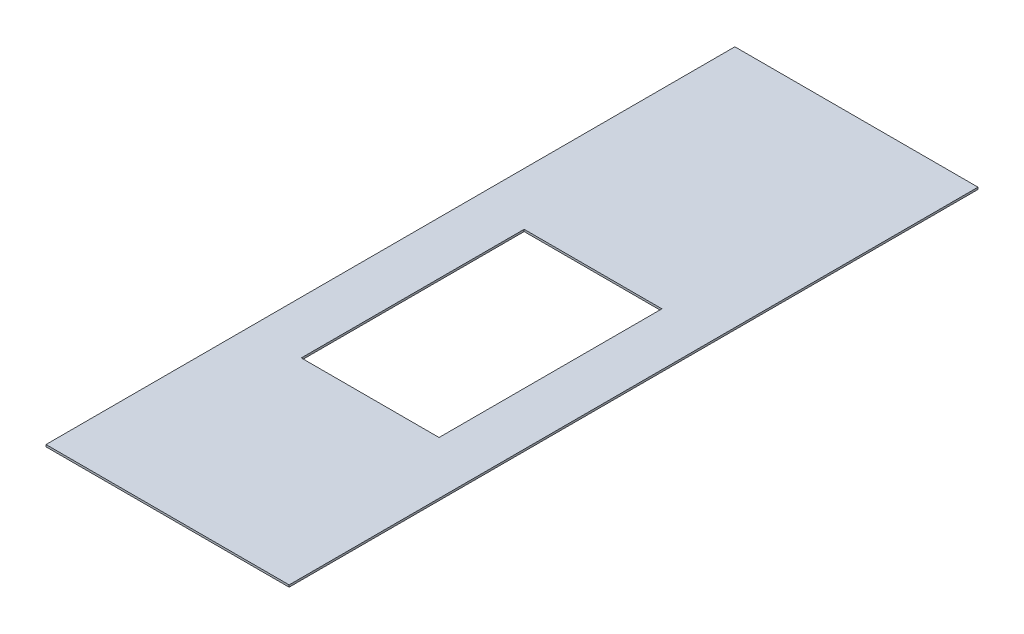
ISO-10303-21;
HEADER;
FILE_DESCRIPTION(('STEP AP214'),'2;1');
FILE_NAME('part.step','',(''),(''),'','','');
FILE_SCHEMA(('AUTOMOTIVE_DESIGN { 1 0 10303 214 1 1 1 1 }'));
ENDSEC;
DATA;
#1=APPLICATION_CONTEXT('core data for automotive mechanical design processes');
#2=APPLICATION_PROTOCOL_DEFINITION('international standard','automotive_design',2000,#1);
#3=PRODUCT_CONTEXT('',#1,'mechanical');
#4=PRODUCT('Part','Part','',(#3));
#5=PRODUCT_RELATED_PRODUCT_CATEGORY('part','',(#4));
#6=PRODUCT_DEFINITION_FORMATION('','',#4);
#7=PRODUCT_DEFINITION_CONTEXT('part definition',#1,'design');
#8=PRODUCT_DEFINITION('design','',#6,#7);
#9=PRODUCT_DEFINITION_SHAPE('','',#8);
#10=(LENGTH_UNIT() NAMED_UNIT(*) SI_UNIT(.MILLI.,.METRE.));
#11=(NAMED_UNIT(*) PLANE_ANGLE_UNIT() SI_UNIT($,.RADIAN.));
#12=(NAMED_UNIT(*) SI_UNIT($,.STERADIAN.) SOLID_ANGLE_UNIT());
#13=UNCERTAINTY_MEASURE_WITH_UNIT(LENGTH_MEASURE(1.E-05),#10,'distance_accuracy_value','');
#14=(GEOMETRIC_REPRESENTATION_CONTEXT(3) GLOBAL_UNCERTAINTY_ASSIGNED_CONTEXT((#13)) GLOBAL_UNIT_ASSIGNED_CONTEXT((#10,
#11,#12)) REPRESENTATION_CONTEXT('',''));
#15=CARTESIAN_POINT('',(0.,0.,0.));
#16=DIRECTION('',(0.,0.,1.));
#17=DIRECTION('',(1.,0.,0.));
#18=AXIS2_PLACEMENT_3D('',#15,#16,#17);
#19=CARTESIAN_POINT('',(-30.,0.5,85.));
#20=DIRECTION('',(1.,0.,0.));
#21=DIRECTION('',(0.,0.,-1.));
#22=AXIS2_PLACEMENT_3D('',#19,#20,#21);
#23=PLANE('',#22);
#24=DIRECTION('',(0.,0.,1.));
#25=VECTOR('',#24,1.);
#26=CARTESIAN_POINT('',(-30.,0.,85.));
#27=LINE('',#26,#25);
#28=CARTESIAN_POINT('',(-30.,0.,-85.));
#29=VERTEX_POINT('',#28);
#30=CARTESIAN_POINT('',(-30.,0.,85.));
#31=VERTEX_POINT('',#30);
#32=EDGE_CURVE('E132',#29,#31,#27,.T.);
#33=ORIENTED_EDGE('',*,*,#32,.T.);
#34=DIRECTION('',(0.,-1.,0.));
#35=VECTOR('',#34,1.);
#36=CARTESIAN_POINT('',(-30.,0.5,85.));
#37=LINE('',#36,#35);
#38=CARTESIAN_POINT('',(-30.,0.5,85.));
#39=VERTEX_POINT('',#38);
#40=EDGE_CURVE('E11',#39,#31,#37,.T.);
#41=ORIENTED_EDGE('',*,*,#40,.F.);
#42=DIRECTION('',(0.,0.,1.));
#43=VECTOR('',#42,1.);
#44=CARTESIAN_POINT('',(-30.,0.5,85.));
#45=LINE('',#44,#43);
#46=CARTESIAN_POINT('',(-30.,0.5,-85.));
#47=VERTEX_POINT('',#46);
#48=EDGE_CURVE('E133',#47,#39,#45,.T.);
#49=ORIENTED_EDGE('',*,*,#48,.F.);
#50=DIRECTION('',(0.,-1.,0.));
#51=VECTOR('',#50,1.);
#52=CARTESIAN_POINT('',(-30.,0.5,-85.));
#53=LINE('',#52,#51);
#54=EDGE_CURVE('E143',#47,#29,#53,.T.);
#55=ORIENTED_EDGE('',*,*,#54,.T.);
#56=EDGE_LOOP('',(#33,#41,#49,#55));
#57=FACE_BOUND('',#56,.T.);
#58=ADVANCED_FACE('F33',(#57),#23,.F.);
#59=CARTESIAN_POINT('',(30.,0.5,85.));
#60=DIRECTION('',(0.,0.,-1.));
#61=DIRECTION('',(-1.,0.,0.));
#62=AXIS2_PLACEMENT_3D('',#59,#60,#61);
#63=PLANE('',#62);
#64=DIRECTION('',(1.,0.,0.));
#65=VECTOR('',#64,1.);
#66=CARTESIAN_POINT('',(30.,0.,85.));
#67=LINE('',#66,#65);
#68=CARTESIAN_POINT('',(30.,0.,85.));
#69=VERTEX_POINT('',#68);
#70=EDGE_CURVE('E146',#31,#69,#67,.T.);
#71=ORIENTED_EDGE('',*,*,#70,.T.);
#72=DIRECTION('',(0.,-1.,0.));
#73=VECTOR('',#72,1.);
#74=CARTESIAN_POINT('',(30.,0.5,85.));
#75=LINE('',#74,#73);
#76=CARTESIAN_POINT('',(30.,0.5,85.));
#77=VERTEX_POINT('',#76);
#78=EDGE_CURVE('E40',#77,#69,#75,.T.);
#79=ORIENTED_EDGE('',*,*,#78,.F.);
#80=DIRECTION('',(1.,0.,0.));
#81=VECTOR('',#80,1.);
#82=CARTESIAN_POINT('',(30.,0.5,85.));
#83=LINE('',#82,#81);
#84=EDGE_CURVE('E136',#39,#77,#83,.T.);
#85=ORIENTED_EDGE('',*,*,#84,.F.);
#86=ORIENTED_EDGE('',*,*,#40,.T.);
#87=EDGE_LOOP('',(#71,#79,#85,#86));
#88=FACE_BOUND('',#87,.T.);
#89=ADVANCED_FACE('F174',(#88),#63,.F.);
#90=CARTESIAN_POINT('',(30.,0.5,85.));
#91=DIRECTION('',(-1.,0.,0.));
#92=DIRECTION('',(0.,0.,1.));
#93=AXIS2_PLACEMENT_3D('',#90,#91,#92);
#94=PLANE('',#93);
#95=DIRECTION('',(0.,0.,-1.));
#96=VECTOR('',#95,1.);
#97=CARTESIAN_POINT('',(30.,0.,85.));
#98=LINE('',#97,#96);
#99=CARTESIAN_POINT('',(30.,0.,-85.));
#100=VERTEX_POINT('',#99);
#101=EDGE_CURVE('E148',#69,#100,#98,.T.);
#102=ORIENTED_EDGE('',*,*,#101,.T.);
#103=DIRECTION('',(0.,-1.,0.));
#104=VECTOR('',#103,1.);
#105=CARTESIAN_POINT('',(30.,0.5,-85.));
#106=LINE('',#105,#104);
#107=CARTESIAN_POINT('',(30.,0.5,-85.));
#108=VERTEX_POINT('',#107);
#109=EDGE_CURVE('E153',#108,#100,#106,.T.);
#110=ORIENTED_EDGE('',*,*,#109,.F.);
#111=DIRECTION('',(0.,0.,-1.));
#112=VECTOR('',#111,1.);
#113=CARTESIAN_POINT('',(30.,0.5,85.));
#114=LINE('',#113,#112);
#115=EDGE_CURVE('E139',#77,#108,#114,.T.);
#116=ORIENTED_EDGE('',*,*,#115,.F.);
#117=ORIENTED_EDGE('',*,*,#78,.T.);
#118=EDGE_LOOP('',(#102,#110,#116,#117));
#119=FACE_BOUND('',#118,.T.);
#120=ADVANCED_FACE('F160',(#119),#94,.F.);
#121=CARTESIAN_POINT('',(30.,0.5,-85.));
#122=DIRECTION('',(0.,0.,1.));
#123=DIRECTION('',(1.,0.,0.));
#124=AXIS2_PLACEMENT_3D('',#121,#122,#123);
#125=PLANE('',#124);
#126=DIRECTION('',(-1.,0.,0.));
#127=VECTOR('',#126,1.);
#128=CARTESIAN_POINT('',(30.,0.,-85.));
#129=LINE('',#128,#127);
#130=EDGE_CURVE('E137',#100,#29,#129,.T.);
#131=ORIENTED_EDGE('',*,*,#130,.T.);
#132=ORIENTED_EDGE('',*,*,#54,.F.);
#133=DIRECTION('',(-1.,0.,0.));
#134=VECTOR('',#133,1.);
#135=CARTESIAN_POINT('',(30.,0.5,-85.));
#136=LINE('',#135,#134);
#137=EDGE_CURVE('E141',#108,#47,#136,.T.);
#138=ORIENTED_EDGE('',*,*,#137,.F.);
#139=ORIENTED_EDGE('',*,*,#109,.T.);
#140=EDGE_LOOP('',(#131,#132,#138,#139));
#141=FACE_BOUND('',#140,.T.);
#142=ADVANCED_FACE('F167',(#141),#125,.F.);
#143=CARTESIAN_POINT('',(0.,0.5,0.));
#144=DIRECTION('',(0.,1.,0.));
#145=DIRECTION('',(0.,0.,1.));
#146=AXIS2_PLACEMENT_3D('',#143,#144,#145);
#147=PLANE('',#146);
#148=DIRECTION('',(0.,0.,-1.));
#149=VECTOR('',#148,1.);
#150=CARTESIAN_POINT('',(17.,0.5,0.));
#151=LINE('',#150,#149);
#152=CARTESIAN_POINT('',(17.,0.5,35.));
#153=VERTEX_POINT('',#152);
#154=CARTESIAN_POINT('',(17.,0.5,-20.));
#155=VERTEX_POINT('',#154);
#156=EDGE_CURVE('E130',#153,#155,#151,.T.);
#157=ORIENTED_EDGE('',*,*,#156,.F.);
#158=DIRECTION('',(1.,0.,0.));
#159=VECTOR('',#158,1.);
#160=CARTESIAN_POINT('',(0.,0.5,35.));
#161=LINE('',#160,#159);
#162=CARTESIAN_POINT('',(-17.,0.5,35.));
#163=VERTEX_POINT('',#162);
#164=EDGE_CURVE('E123',#163,#153,#161,.T.);
#165=ORIENTED_EDGE('',*,*,#164,.F.);
#166=DIRECTION('',(0.,0.,1.));
#167=VECTOR('',#166,1.);
#168=CARTESIAN_POINT('',(-17.,0.5,0.));
#169=LINE('',#168,#167);
#170=CARTESIAN_POINT('',(-17.,0.5,-20.));
#171=VERTEX_POINT('',#170);
#172=EDGE_CURVE('E103',#171,#163,#169,.T.);
#173=ORIENTED_EDGE('',*,*,#172,.F.);
#174=DIRECTION('',(-1.,0.,0.));
#175=VECTOR('',#174,1.);
#176=CARTESIAN_POINT('',(0.,0.5,-20.));
#177=LINE('',#176,#175);
#178=EDGE_CURVE('E128',#155,#171,#177,.T.);
#179=ORIENTED_EDGE('',*,*,#178,.F.);
#180=EDGE_LOOP('',(#157,#165,#173,#179));
#181=FACE_BOUND('',#180,.T.);
#182=ORIENTED_EDGE('',*,*,#48,.T.);
#183=ORIENTED_EDGE('',*,*,#84,.T.);
#184=ORIENTED_EDGE('',*,*,#115,.T.);
#185=ORIENTED_EDGE('',*,*,#137,.T.);
#186=EDGE_LOOP('',(#182,#183,#184,#185));
#187=FACE_BOUND('',#186,.T.);
#188=ADVANCED_FACE('F173',(#181,#187),#147,.T.);
#189=CARTESIAN_POINT('',(0.,0.,0.));
#190=DIRECTION('',(0.,1.,0.));
#191=DIRECTION('',(0.,0.,1.));
#192=AXIS2_PLACEMENT_3D('',#189,#190,#191);
#193=PLANE('',#192);
#194=DIRECTION('',(-1.,0.,0.));
#195=VECTOR('',#194,1.);
#196=CARTESIAN_POINT('',(17.,0.,35.));
#197=LINE('',#196,#195);
#198=CARTESIAN_POINT('',(17.,0.,35.));
#199=VERTEX_POINT('',#198);
#200=CARTESIAN_POINT('',(-17.,0.,35.));
#201=VERTEX_POINT('',#200);
#202=EDGE_CURVE('E109',#199,#201,#197,.T.);
#203=ORIENTED_EDGE('',*,*,#202,.F.);
#204=DIRECTION('',(0.,0.,1.));
#205=VECTOR('',#204,1.);
#206=CARTESIAN_POINT('',(17.,0.,-20.));
#207=LINE('',#206,#205);
#208=CARTESIAN_POINT('',(17.,0.,-20.));
#209=VERTEX_POINT('',#208);
#210=EDGE_CURVE('E55',#209,#199,#207,.T.);
#211=ORIENTED_EDGE('',*,*,#210,.F.);
#212=DIRECTION('',(1.,0.,0.));
#213=VECTOR('',#212,1.);
#214=CARTESIAN_POINT('',(17.,0.,-20.));
#215=LINE('',#214,#213);
#216=CARTESIAN_POINT('',(-17.,0.,-20.));
#217=VERTEX_POINT('',#216);
#218=EDGE_CURVE('E116',#217,#209,#215,.T.);
#219=ORIENTED_EDGE('',*,*,#218,.F.);
#220=DIRECTION('',(0.,0.,-1.));
#221=VECTOR('',#220,1.);
#222=CARTESIAN_POINT('',(-17.,0.,-20.));
#223=LINE('',#222,#221);
#224=EDGE_CURVE('E100',#201,#217,#223,.T.);
#225=ORIENTED_EDGE('',*,*,#224,.F.);
#226=EDGE_LOOP('',(#203,#211,#219,#225));
#227=FACE_BOUND('',#226,.T.);
#228=ORIENTED_EDGE('',*,*,#32,.F.);
#229=ORIENTED_EDGE('',*,*,#130,.F.);
#230=ORIENTED_EDGE('',*,*,#101,.F.);
#231=ORIENTED_EDGE('',*,*,#70,.F.);
#232=EDGE_LOOP('',(#228,#229,#230,#231));
#233=FACE_BOUND('',#232,.T.);
#234=ADVANCED_FACE('F113',(#227,#233),#193,.F.);
#235=CARTESIAN_POINT('',(17.,10.,-20.));
#236=DIRECTION('',(1.,0.,0.));
#237=DIRECTION('',(0.,0.,-1.));
#238=AXIS2_PLACEMENT_3D('',#235,#236,#237);
#239=PLANE('',#238);
#240=ORIENTED_EDGE('',*,*,#156,.T.);
#241=DIRECTION('',(0.,-1.,0.));
#242=VECTOR('',#241,1.);
#243=CARTESIAN_POINT('',(17.,10.,-20.));
#244=LINE('',#243,#242);
#245=EDGE_CURVE('E121',#155,#209,#244,.T.);
#246=ORIENTED_EDGE('',*,*,#245,.T.);
#247=ORIENTED_EDGE('',*,*,#210,.T.);
#248=DIRECTION('',(0.,-1.,0.));
#249=VECTOR('',#248,1.);
#250=CARTESIAN_POINT('',(17.,10.,35.));
#251=LINE('',#250,#249);
#252=EDGE_CURVE('E106',#153,#199,#251,.T.);
#253=ORIENTED_EDGE('',*,*,#252,.F.);
#254=EDGE_LOOP('',(#240,#246,#247,#253));
#255=FACE_BOUND('',#254,.T.);
#256=ADVANCED_FACE('F186',(#255),#239,.F.);
#257=CARTESIAN_POINT('',(17.,10.,-20.));
#258=DIRECTION('',(0.,0.,-1.));
#259=DIRECTION('',(-1.,0.,0.));
#260=AXIS2_PLACEMENT_3D('',#257,#258,#259);
#261=PLANE('',#260);
#262=ORIENTED_EDGE('',*,*,#178,.T.);
#263=DIRECTION('',(0.,-1.,0.));
#264=VECTOR('',#263,1.);
#265=CARTESIAN_POINT('',(-17.,10.,-20.));
#266=LINE('',#265,#264);
#267=EDGE_CURVE('E105',#171,#217,#266,.T.);
#268=ORIENTED_EDGE('',*,*,#267,.T.);
#269=ORIENTED_EDGE('',*,*,#218,.T.);
#270=ORIENTED_EDGE('',*,*,#245,.F.);
#271=EDGE_LOOP('',(#262,#268,#269,#270));
#272=FACE_BOUND('',#271,.T.);
#273=ADVANCED_FACE('F192',(#272),#261,.F.);
#274=CARTESIAN_POINT('',(-17.,10.,-20.));
#275=DIRECTION('',(-1.,0.,0.));
#276=DIRECTION('',(0.,0.,1.));
#277=AXIS2_PLACEMENT_3D('',#274,#275,#276);
#278=PLANE('',#277);
#279=ORIENTED_EDGE('',*,*,#172,.T.);
#280=DIRECTION('',(0.,-1.,0.));
#281=VECTOR('',#280,1.);
#282=CARTESIAN_POINT('',(-17.,10.,35.));
#283=LINE('',#282,#281);
#284=EDGE_CURVE('E47',#163,#201,#283,.T.);
#285=ORIENTED_EDGE('',*,*,#284,.T.);
#286=ORIENTED_EDGE('',*,*,#224,.T.);
#287=ORIENTED_EDGE('',*,*,#267,.F.);
#288=EDGE_LOOP('',(#279,#285,#286,#287));
#289=FACE_BOUND('',#288,.T.);
#290=ADVANCED_FACE('F97',(#289),#278,.F.);
#291=CARTESIAN_POINT('',(17.,10.,35.));
#292=DIRECTION('',(0.,0.,1.));
#293=DIRECTION('',(1.,0.,0.));
#294=AXIS2_PLACEMENT_3D('',#291,#292,#293);
#295=PLANE('',#294);
#296=ORIENTED_EDGE('',*,*,#164,.T.);
#297=ORIENTED_EDGE('',*,*,#252,.T.);
#298=ORIENTED_EDGE('',*,*,#202,.T.);
#299=ORIENTED_EDGE('',*,*,#284,.F.);
#300=EDGE_LOOP('',(#296,#297,#298,#299));
#301=FACE_BOUND('',#300,.T.);
#302=ADVANCED_FACE('F110',(#301),#295,.F.);
#303=CLOSED_SHELL('',(#58,#89,#120,#142,#188,#234,#256,#273,#290,#302));
#304=MANIFOLD_SOLID_BREP('B2',#303);
#305=ADVANCED_BREP_SHAPE_REPRESENTATION('',(#18,#304),#14);
#306=SHAPE_DEFINITION_REPRESENTATION(#9,#305);
ENDSEC;
END-ISO-10303-21;
